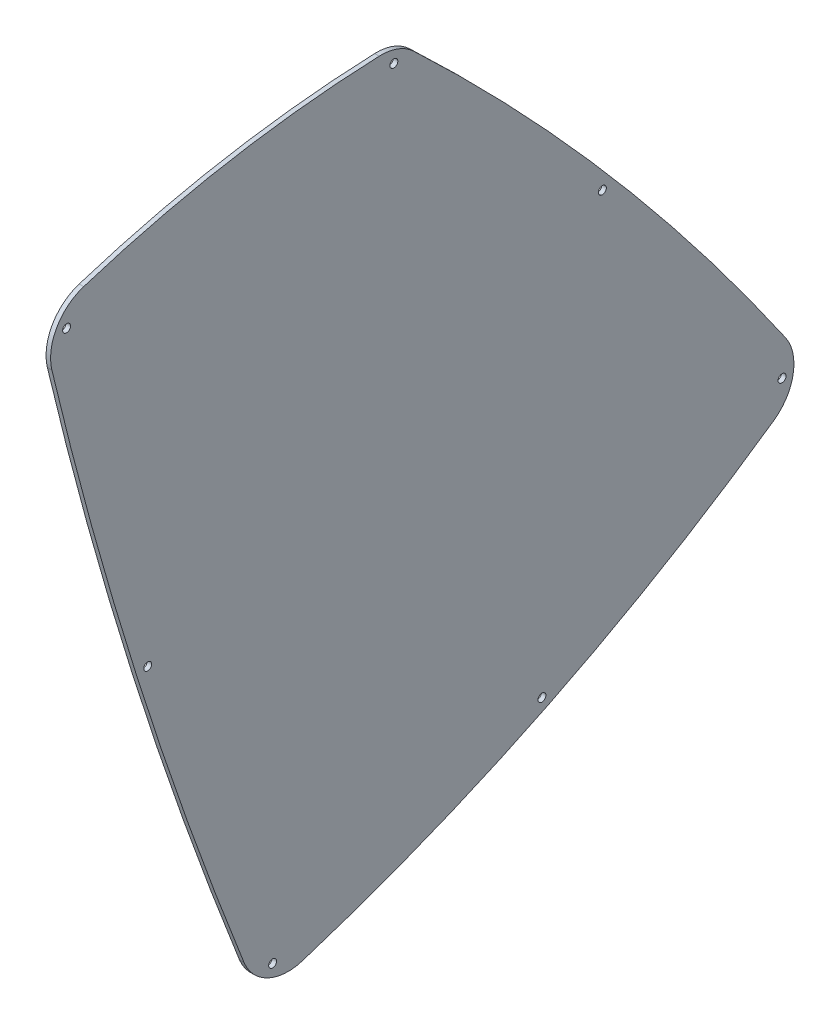
ISO-10303-21;
HEADER;
FILE_DESCRIPTION(('STEP AP214'),'2;1');
FILE_NAME('part.step','',(''),(''),'','','');
FILE_SCHEMA(('AUTOMOTIVE_DESIGN { 1 0 10303 214 1 1 1 1 }'));
ENDSEC;
DATA;
#1=APPLICATION_CONTEXT('core data for automotive mechanical design processes');
#2=APPLICATION_PROTOCOL_DEFINITION('international standard','automotive_design',2000,#1);
#3=PRODUCT_CONTEXT('',#1,'mechanical');
#4=PRODUCT('Part','Part','',(#3));
#5=PRODUCT_RELATED_PRODUCT_CATEGORY('part','',(#4));
#6=PRODUCT_DEFINITION_FORMATION('','',#4);
#7=PRODUCT_DEFINITION_CONTEXT('part definition',#1,'design');
#8=PRODUCT_DEFINITION('design','',#6,#7);
#9=PRODUCT_DEFINITION_SHAPE('','',#8);
#10=(LENGTH_UNIT() NAMED_UNIT(*) SI_UNIT(.MILLI.,.METRE.));
#11=(NAMED_UNIT(*) PLANE_ANGLE_UNIT() SI_UNIT($,.RADIAN.));
#12=(NAMED_UNIT(*) SI_UNIT($,.STERADIAN.) SOLID_ANGLE_UNIT());
#13=UNCERTAINTY_MEASURE_WITH_UNIT(LENGTH_MEASURE(1.E-05),#10,'distance_accuracy_value','');
#14=(GEOMETRIC_REPRESENTATION_CONTEXT(3) GLOBAL_UNCERTAINTY_ASSIGNED_CONTEXT((#13)) GLOBAL_UNIT_ASSIGNED_CONTEXT((#10,
#11,#12)) REPRESENTATION_CONTEXT('',''));
#15=CARTESIAN_POINT('',(0.,0.,0.));
#16=DIRECTION('',(0.,0.,1.));
#17=DIRECTION('',(1.,0.,0.));
#18=AXIS2_PLACEMENT_3D('',#15,#16,#17);
#19=CARTESIAN_POINT('',(2.,349.878011883501,663.961249422803));
#20=DIRECTION('',(1.,0.,0.));
#21=DIRECTION('',(0.,0.,-1.));
#22=AXIS2_PLACEMENT_3D('',#19,#20,#21);
#23=PLANE('',#22);
#24=CARTESIAN_POINT('',(2.,68.9927015622542,1381.04378584218));
#25=DIRECTION('',(1.,0.,0.));
#26=DIRECTION('',(0.,0.,-1.));
#27=AXIS2_PLACEMENT_3D('',#24,#25,#26);
#28=CIRCLE('',#27,1.74999999999987);
#29=CARTESIAN_POINT('',(2.,68.9927015622542,1379.29378584218));
#30=VERTEX_POINT('',#29);
#31=EDGE_CURVE('E203',#30,#30,#28,.T.);
#32=ORIENTED_EDGE('',*,*,#31,.F.);
#33=EDGE_LOOP('',(#32));
#34=FACE_BOUND('',#33,.T.);
#35=CARTESIAN_POINT('',(2.,134.456762464315,1617.5244171696));
#36=DIRECTION('',(1.,0.,0.));
#37=DIRECTION('',(0.,0.,-1.));
#38=AXIS2_PLACEMENT_3D('',#35,#36,#37);
#39=CIRCLE('',#38,1.74999999999987);
#40=CARTESIAN_POINT('',(2.,134.456762464315,1615.7744171696));
#41=VERTEX_POINT('',#40);
#42=EDGE_CURVE('E191',#41,#41,#39,.T.);
#43=ORIENTED_EDGE('',*,*,#42,.F.);
#44=EDGE_LOOP('',(#43));
#45=FACE_BOUND('',#44,.T.);
#46=CARTESIAN_POINT('',(2.,-153.787607790801,1526.58797668578));
#47=DIRECTION('',(1.,0.,0.));
#48=DIRECTION('',(0.,0.,-1.));
#49=AXIS2_PLACEMENT_3D('',#46,#47,#48);
#50=CIRCLE('',#49,1.74999999999987);
#51=CARTESIAN_POINT('',(2.,-153.787607790801,1524.83797668578));
#52=VERTEX_POINT('',#51);
#53=EDGE_CURVE('E179',#52,#52,#50,.T.);
#54=ORIENTED_EDGE('',*,*,#53,.F.);
#55=EDGE_LOOP('',(#54));
#56=FACE_BOUND('',#55,.T.);
#57=CARTESIAN_POINT('',(2.,126.585837185612,1603.59428668719));
#58=DIRECTION('',(1.,0.,0.));
#59=DIRECTION('',(0.,0.,-1.));
#60=AXIS2_PLACEMENT_3D('',#57,#58,#59);
#61=CIRCLE('',#60,20.9999999999997);
#62=CARTESIAN_POINT('',(2.,146.592071884232,1609.97790424964));
#63=VERTEX_POINT('',#62);
#64=CARTESIAN_POINT('',(2.,121.730654260932,1624.0253218731));
#65=VERTEX_POINT('',#64);
#66=EDGE_CURVE('E142',#63,#65,#61,.T.);
#67=ORIENTED_EDGE('',*,*,#66,.T.);
#68=CARTESIAN_POINT('',(2.,573.17018658139,-275.671787841579));
#69=DIRECTION('',(1.,0.,0.));
#70=DIRECTION('',(0.,0.,-1.));
#71=AXIS2_PLACEMENT_3D('',#68,#69,#70);
#72=CIRCLE('',#71,1952.6);
#73=CARTESIAN_POINT('',(2.,-147.086014910758,1539.2325523957));
#74=VERTEX_POINT('',#73);
#75=EDGE_CURVE('E90',#65,#74,#72,.T.);
#76=ORIENTED_EDGE('',*,*,#75,.T.);
#77=CARTESIAN_POINT('',(2.,-139.339738033091,1519.71345419587));
#78=DIRECTION('',(1.,0.,0.));
#79=DIRECTION('',(0.,0.,-1.));
#80=AXIS2_PLACEMENT_3D('',#77,#78,#79);
#81=CIRCLE('',#80,21.0000000000002);
#82=CARTESIAN_POINT('',(2.,-159.371937758911,1513.41178980106));
#83=VERTEX_POINT('',#82);
#84=EDGE_CURVE('E157',#74,#83,#81,.T.);
#85=ORIENTED_EDGE('',*,*,#84,.T.);
#86=CARTESIAN_POINT('',(2.,566.556823733921,1741.77210429875));
#87=DIRECTION('',(1.,0.,0.));
#88=DIRECTION('',(0.,0.,-1.));
#89=AXIS2_PLACEMENT_3D('',#86,#87,#88);
#90=CIRCLE('',#89,761.);
#91=CARTESIAN_POINT('',(2.,-56.9381211241414,1305.45220590258));
#92=VERTEX_POINT('',#91);
#93=EDGE_CURVE('E170',#83,#92,#90,.T.);
#94=ORIENTED_EDGE('',*,*,#93,.T.);
#95=CARTESIAN_POINT('',(2.,-39.7326101622236,1317.49257103572));
#96=DIRECTION('',(1.,0.,0.));
#97=DIRECTION('',(0.,0.,-1.));
#98=AXIS2_PLACEMENT_3D('',#95,#96,#97);
#99=CIRCLE('',#98,21.0000000000001);
#100=CARTESIAN_POINT('',(2.,-27.8056829045682,1300.20823112381));
#101=VERTEX_POINT('',#100);
#102=EDGE_CURVE('E109',#92,#101,#99,.T.);
#103=ORIENTED_EDGE('',*,*,#102,.T.);
#104=CARTESIAN_POINT('',(2.,-715.59182142936,2296.93849937754));
#105=DIRECTION('',(1.,0.,0.));
#106=DIRECTION('',(0.,0.,-1.));
#107=AXIS2_PLACEMENT_3D('',#104,#105,#106);
#108=CIRCLE('',#107,1211.);
#109=CARTESIAN_POINT('',(2.,163.730785841053,1464.28445816765));
#110=VERTEX_POINT('',#109);
#111=EDGE_CURVE('E103',#101,#110,#108,.T.);
#112=ORIENTED_EDGE('',*,*,#111,.T.);
#113=CARTESIAN_POINT('',(2.,148.48241692885,1478.72354558747));
#114=DIRECTION('',(1.,0.,0.));
#115=DIRECTION('',(0.,0.,-1.));
#116=AXIS2_PLACEMENT_3D('',#113,#114,#115);
#117=CIRCLE('',#116,21.);
#118=CARTESIAN_POINT('',(2.,169.467009445785,1479.52783216462));
#119=VERTEX_POINT('',#118);
#120=EDGE_CURVE('E107',#110,#119,#117,.T.);
#121=ORIENTED_EDGE('',*,*,#120,.T.);
#122=CARTESIAN_POINT('',(2.,-321.172748926367,1460.72284600361));
#123=DIRECTION('',(1.,0.,0.));
#124=DIRECTION('',(0.,0.,-1.));
#125=AXIS2_PLACEMENT_3D('',#122,#123,#124);
#126=CIRCLE('',#125,491.);
#127=EDGE_CURVE('E47',#119,#63,#126,.T.);
#128=ORIENTED_EDGE('',*,*,#127,.T.);
#129=EDGE_LOOP('',(#67,#76,#85,#94,#103,#112,#121,#128));
#130=FACE_BOUND('',#129,.T.);
#131=CARTESIAN_POINT('',(2.,-12.7056417679601,1581.71758268792));
#132=DIRECTION('',(1.,0.,0.));
#133=DIRECTION('',(0.,0.,-1.));
#134=AXIS2_PLACEMENT_3D('',#131,#132,#133);
#135=CIRCLE('',#134,1.74999999999987);
#136=CARTESIAN_POINT('',(2.,-12.7056417679601,1579.96758268792));
#137=VERTEX_POINT('',#136);
#138=EDGE_CURVE('E131',#137,#137,#135,.T.);
#139=ORIENTED_EDGE('',*,*,#138,.F.);
#140=EDGE_LOOP('',(#139));
#141=FACE_BOUND('',#140,.T.);
#142=CARTESIAN_POINT('',(2.,-111.634778861247,1407.71799166219));
#143=DIRECTION('',(1.,0.,0.));
#144=DIRECTION('',(0.,0.,-1.));
#145=AXIS2_PLACEMENT_3D('',#142,#143,#144);
#146=CIRCLE('',#145,1.74999999999987);
#147=CARTESIAN_POINT('',(2.,-111.634778861247,1405.96799166219));
#148=VERTEX_POINT('',#147);
#149=EDGE_CURVE('E185',#148,#148,#146,.T.);
#150=ORIENTED_EDGE('',*,*,#149,.F.);
#151=EDGE_LOOP('',(#150));
#152=FACE_BOUND('',#151,.T.);
#153=CARTESIAN_POINT('',(2.,-42.5671292873626,1301.74565065968));
#154=DIRECTION('',(1.,0.,0.));
#155=DIRECTION('',(0.,0.,-1.));
#156=AXIS2_PLACEMENT_3D('',#153,#154,#155);
#157=CIRCLE('',#156,1.74999999999987);
#158=CARTESIAN_POINT('',(2.,-42.5671292873626,1299.99565065968));
#159=VERTEX_POINT('',#158);
#160=EDGE_CURVE('E197',#159,#159,#157,.T.);
#161=ORIENTED_EDGE('',*,*,#160,.F.);
#162=EDGE_LOOP('',(#161));
#163=FACE_BOUND('',#162,.T.);
#164=CARTESIAN_POINT('',(2.,163.457227862599,1473.0883847647));
#165=DIRECTION('',(1.,0.,0.));
#166=DIRECTION('',(0.,0.,-1.));
#167=AXIS2_PLACEMENT_3D('',#164,#165,#166);
#168=CIRCLE('',#167,1.74999999999987);
#169=CARTESIAN_POINT('',(2.,163.457227862599,1471.3383847647));
#170=VERTEX_POINT('',#169);
#171=EDGE_CURVE('E209',#170,#170,#168,.T.);
#172=ORIENTED_EDGE('',*,*,#171,.F.);
#173=EDGE_LOOP('',(#172));
#174=FACE_BOUND('',#173,.T.);
#175=ADVANCED_FACE('F30',(#34,#45,#56,#130,#141,#152,#163,#174),#23,.T.);
#176=CARTESIAN_POINT('',(0.,349.878011883501,663.961249422803));
#177=DIRECTION('',(1.,0.,0.));
#178=DIRECTION('',(0.,0.,-1.));
#179=AXIS2_PLACEMENT_3D('',#176,#177,#178);
#180=PLANE('',#179);
#181=CARTESIAN_POINT('',(0.,126.585837185612,1603.59428668719));
#182=DIRECTION('',(1.,0.,0.));
#183=DIRECTION('',(0.,0.,-1.));
#184=AXIS2_PLACEMENT_3D('',#181,#182,#183);
#185=CIRCLE('',#184,20.9999999999997);
#186=CARTESIAN_POINT('',(0.,146.592071884232,1609.97790424964));
#187=VERTEX_POINT('',#186);
#188=CARTESIAN_POINT('',(0.,121.730654260932,1624.0253218731));
#189=VERTEX_POINT('',#188);
#190=EDGE_CURVE('E127',#187,#189,#185,.T.);
#191=ORIENTED_EDGE('',*,*,#190,.F.);
#192=CARTESIAN_POINT('',(0.,-321.172748926367,1460.72284600361));
#193=DIRECTION('',(1.,0.,0.));
#194=DIRECTION('',(0.,0.,-1.));
#195=AXIS2_PLACEMENT_3D('',#192,#193,#194);
#196=CIRCLE('',#195,491.);
#197=CARTESIAN_POINT('',(0.,169.467009445785,1479.52783216462));
#198=VERTEX_POINT('',#197);
#199=EDGE_CURVE('E82',#198,#187,#196,.T.);
#200=ORIENTED_EDGE('',*,*,#199,.F.);
#201=CARTESIAN_POINT('',(0.,148.48241692885,1478.72354558747));
#202=DIRECTION('',(1.,0.,0.));
#203=DIRECTION('',(0.,0.,-1.));
#204=AXIS2_PLACEMENT_3D('',#201,#202,#203);
#205=CIRCLE('',#204,21.);
#206=CARTESIAN_POINT('',(0.,163.730785841053,1464.28445816765));
#207=VERTEX_POINT('',#206);
#208=EDGE_CURVE('E76',#207,#198,#205,.T.);
#209=ORIENTED_EDGE('',*,*,#208,.F.);
#210=CARTESIAN_POINT('',(0.,-715.59182142936,2296.93849937754));
#211=DIRECTION('',(1.,0.,0.));
#212=DIRECTION('',(0.,0.,-1.));
#213=AXIS2_PLACEMENT_3D('',#210,#211,#212);
#214=CIRCLE('',#213,1211.);
#215=CARTESIAN_POINT('',(0.,-27.8056829045682,1300.20823112381));
#216=VERTEX_POINT('',#215);
#217=EDGE_CURVE('E117',#216,#207,#214,.T.);
#218=ORIENTED_EDGE('',*,*,#217,.F.);
#219=CARTESIAN_POINT('',(0.,-39.7326101622236,1317.49257103572));
#220=DIRECTION('',(1.,0.,0.));
#221=DIRECTION('',(0.,0.,-1.));
#222=AXIS2_PLACEMENT_3D('',#219,#220,#221);
#223=CIRCLE('',#222,21.0000000000001);
#224=CARTESIAN_POINT('',(0.,-56.9381211241414,1305.45220590258));
#225=VERTEX_POINT('',#224);
#226=EDGE_CURVE('E137',#225,#216,#223,.T.);
#227=ORIENTED_EDGE('',*,*,#226,.F.);
#228=CARTESIAN_POINT('',(0.,566.556823733921,1741.77210429875));
#229=DIRECTION('',(1.,0.,0.));
#230=DIRECTION('',(0.,0.,-1.));
#231=AXIS2_PLACEMENT_3D('',#228,#229,#230);
#232=CIRCLE('',#231,761.);
#233=CARTESIAN_POINT('',(0.,-159.371937758911,1513.41178980106));
#234=VERTEX_POINT('',#233);
#235=EDGE_CURVE('E135',#234,#225,#232,.T.);
#236=ORIENTED_EDGE('',*,*,#235,.F.);
#237=CARTESIAN_POINT('',(0.,-139.339738033091,1519.71345419587));
#238=DIRECTION('',(1.,0.,0.));
#239=DIRECTION('',(0.,0.,-1.));
#240=AXIS2_PLACEMENT_3D('',#237,#238,#239);
#241=CIRCLE('',#240,21.0000000000002);
#242=CARTESIAN_POINT('',(0.,-147.086014910758,1539.2325523957));
#243=VERTEX_POINT('',#242);
#244=EDGE_CURVE('E133',#243,#234,#241,.T.);
#245=ORIENTED_EDGE('',*,*,#244,.F.);
#246=CARTESIAN_POINT('',(0.,573.17018658139,-275.671787841579));
#247=DIRECTION('',(1.,0.,0.));
#248=DIRECTION('',(0.,0.,-1.));
#249=AXIS2_PLACEMENT_3D('',#246,#247,#248);
#250=CIRCLE('',#249,1952.6);
#251=EDGE_CURVE('E130',#189,#243,#250,.T.);
#252=ORIENTED_EDGE('',*,*,#251,.F.);
#253=EDGE_LOOP('',(#191,#200,#209,#218,#227,#236,#245,#252));
#254=FACE_BOUND('',#253,.T.);
#255=CARTESIAN_POINT('',(0.,-12.7056417679601,1581.71758268792));
#256=DIRECTION('',(1.,0.,0.));
#257=DIRECTION('',(0.,0.,-1.));
#258=AXIS2_PLACEMENT_3D('',#255,#256,#257);
#259=CIRCLE('',#258,1.74999999999987);
#260=CARTESIAN_POINT('',(0.,-12.7056417679601,1579.96758268792));
#261=VERTEX_POINT('',#260);
#262=EDGE_CURVE('E176',#261,#261,#259,.T.);
#263=ORIENTED_EDGE('',*,*,#262,.T.);
#264=EDGE_LOOP('',(#263));
#265=FACE_BOUND('',#264,.T.);
#266=CARTESIAN_POINT('',(0.,-153.787607790801,1526.58797668578));
#267=DIRECTION('',(1.,0.,0.));
#268=DIRECTION('',(0.,0.,-1.));
#269=AXIS2_PLACEMENT_3D('',#266,#267,#268);
#270=CIRCLE('',#269,1.74999999999987);
#271=CARTESIAN_POINT('',(0.,-153.787607790801,1524.83797668578));
#272=VERTEX_POINT('',#271);
#273=EDGE_CURVE('E182',#272,#272,#270,.T.);
#274=ORIENTED_EDGE('',*,*,#273,.T.);
#275=EDGE_LOOP('',(#274));
#276=FACE_BOUND('',#275,.T.);
#277=CARTESIAN_POINT('',(0.,-111.634778861247,1407.71799166219));
#278=DIRECTION('',(1.,0.,0.));
#279=DIRECTION('',(0.,0.,-1.));
#280=AXIS2_PLACEMENT_3D('',#277,#278,#279);
#281=CIRCLE('',#280,1.74999999999987);
#282=CARTESIAN_POINT('',(0.,-111.634778861247,1405.96799166219));
#283=VERTEX_POINT('',#282);
#284=EDGE_CURVE('E188',#283,#283,#281,.T.);
#285=ORIENTED_EDGE('',*,*,#284,.T.);
#286=EDGE_LOOP('',(#285));
#287=FACE_BOUND('',#286,.T.);
#288=CARTESIAN_POINT('',(0.,134.456762464315,1617.5244171696));
#289=DIRECTION('',(1.,0.,0.));
#290=DIRECTION('',(0.,0.,-1.));
#291=AXIS2_PLACEMENT_3D('',#288,#289,#290);
#292=CIRCLE('',#291,1.74999999999987);
#293=CARTESIAN_POINT('',(0.,134.456762464315,1615.7744171696));
#294=VERTEX_POINT('',#293);
#295=EDGE_CURVE('E194',#294,#294,#292,.T.);
#296=ORIENTED_EDGE('',*,*,#295,.T.);
#297=EDGE_LOOP('',(#296));
#298=FACE_BOUND('',#297,.T.);
#299=CARTESIAN_POINT('',(0.,-42.5671292873626,1301.74565065968));
#300=DIRECTION('',(1.,0.,0.));
#301=DIRECTION('',(0.,0.,-1.));
#302=AXIS2_PLACEMENT_3D('',#299,#300,#301);
#303=CIRCLE('',#302,1.74999999999987);
#304=CARTESIAN_POINT('',(0.,-42.5671292873626,1299.99565065968));
#305=VERTEX_POINT('',#304);
#306=EDGE_CURVE('E200',#305,#305,#303,.T.);
#307=ORIENTED_EDGE('',*,*,#306,.T.);
#308=EDGE_LOOP('',(#307));
#309=FACE_BOUND('',#308,.T.);
#310=CARTESIAN_POINT('',(0.,68.9927015622542,1381.04378584218));
#311=DIRECTION('',(1.,0.,0.));
#312=DIRECTION('',(0.,0.,-1.));
#313=AXIS2_PLACEMENT_3D('',#310,#311,#312);
#314=CIRCLE('',#313,1.74999999999987);
#315=CARTESIAN_POINT('',(0.,68.9927015622542,1379.29378584218));
#316=VERTEX_POINT('',#315);
#317=EDGE_CURVE('E206',#316,#316,#314,.T.);
#318=ORIENTED_EDGE('',*,*,#317,.T.);
#319=EDGE_LOOP('',(#318));
#320=FACE_BOUND('',#319,.T.);
#321=CARTESIAN_POINT('',(0.,163.457227862599,1473.0883847647));
#322=DIRECTION('',(1.,0.,0.));
#323=DIRECTION('',(0.,0.,-1.));
#324=AXIS2_PLACEMENT_3D('',#321,#322,#323);
#325=CIRCLE('',#324,1.74999999999987);
#326=CARTESIAN_POINT('',(0.,163.457227862599,1471.3383847647));
#327=VERTEX_POINT('',#326);
#328=EDGE_CURVE('E212',#327,#327,#325,.T.);
#329=ORIENTED_EDGE('',*,*,#328,.T.);
#330=EDGE_LOOP('',(#329));
#331=FACE_BOUND('',#330,.T.);
#332=ADVANCED_FACE('F161',(#254,#265,#276,#287,#298,#309,#320,#331),#180,.F.);
#333=CARTESIAN_POINT('',(2.,126.585837185612,1603.59428668719));
#334=DIRECTION('',(-1.,0.,0.));
#335=DIRECTION('',(0.,0.,1.));
#336=AXIS2_PLACEMENT_3D('',#333,#334,#335);
#337=CYLINDRICAL_SURFACE('',#336,20.9999999999997);
#338=ORIENTED_EDGE('',*,*,#190,.T.);
#339=DIRECTION('',(-1.,0.,0.));
#340=VECTOR('',#339,1.);
#341=CARTESIAN_POINT('',(2.,121.730654260932,1624.0253218731));
#342=LINE('',#341,#340);
#343=EDGE_CURVE('E11',#65,#189,#342,.T.);
#344=ORIENTED_EDGE('',*,*,#343,.F.);
#345=ORIENTED_EDGE('',*,*,#66,.F.);
#346=DIRECTION('',(-1.,0.,0.));
#347=VECTOR('',#346,1.);
#348=CARTESIAN_POINT('',(2.,146.592071884232,1609.97790424964));
#349=LINE('',#348,#347);
#350=EDGE_CURVE('E123',#63,#187,#349,.T.);
#351=ORIENTED_EDGE('',*,*,#350,.T.);
#352=EDGE_LOOP('',(#338,#344,#345,#351));
#353=FACE_BOUND('',#352,.T.);
#354=ADVANCED_FACE('F32',(#353),#337,.T.);
#355=CARTESIAN_POINT('',(2.,573.17018658139,-275.671787841579));
#356=DIRECTION('',(-1.,0.,0.));
#357=DIRECTION('',(0.,0.,1.));
#358=AXIS2_PLACEMENT_3D('',#355,#356,#357);
#359=CYLINDRICAL_SURFACE('',#358,1952.6);
#360=ORIENTED_EDGE('',*,*,#251,.T.);
#361=DIRECTION('',(-1.,0.,0.));
#362=VECTOR('',#361,1.);
#363=CARTESIAN_POINT('',(2.,-147.086014910758,1539.2325523957));
#364=LINE('',#363,#362);
#365=EDGE_CURVE('E39',#74,#243,#364,.T.);
#366=ORIENTED_EDGE('',*,*,#365,.F.);
#367=ORIENTED_EDGE('',*,*,#75,.F.);
#368=ORIENTED_EDGE('',*,*,#343,.T.);
#369=EDGE_LOOP('',(#360,#366,#367,#368));
#370=FACE_BOUND('',#369,.T.);
#371=ADVANCED_FACE('F246',(#370),#359,.T.);
#372=CARTESIAN_POINT('',(2.,-139.339738033091,1519.71345419587));
#373=DIRECTION('',(-1.,0.,0.));
#374=DIRECTION('',(0.,0.,1.));
#375=AXIS2_PLACEMENT_3D('',#372,#373,#374);
#376=CYLINDRICAL_SURFACE('',#375,21.0000000000002);
#377=ORIENTED_EDGE('',*,*,#244,.T.);
#378=DIRECTION('',(-1.,0.,0.));
#379=VECTOR('',#378,1.);
#380=CARTESIAN_POINT('',(2.,-159.371937758911,1513.41178980106));
#381=LINE('',#380,#379);
#382=EDGE_CURVE('E149',#83,#234,#381,.T.);
#383=ORIENTED_EDGE('',*,*,#382,.F.);
#384=ORIENTED_EDGE('',*,*,#84,.F.);
#385=ORIENTED_EDGE('',*,*,#365,.T.);
#386=EDGE_LOOP('',(#377,#383,#384,#385));
#387=FACE_BOUND('',#386,.T.);
#388=ADVANCED_FACE('F155',(#387),#376,.T.);
#389=CARTESIAN_POINT('',(2.,566.556823733921,1741.77210429875));
#390=DIRECTION('',(-1.,0.,0.));
#391=DIRECTION('',(0.,0.,1.));
#392=AXIS2_PLACEMENT_3D('',#389,#390,#391);
#393=CYLINDRICAL_SURFACE('',#392,761.);
#394=ORIENTED_EDGE('',*,*,#235,.T.);
#395=DIRECTION('',(-1.,0.,0.));
#396=VECTOR('',#395,1.);
#397=CARTESIAN_POINT('',(2.,-56.9381211241414,1305.45220590258));
#398=LINE('',#397,#396);
#399=EDGE_CURVE('E146',#92,#225,#398,.T.);
#400=ORIENTED_EDGE('',*,*,#399,.F.);
#401=ORIENTED_EDGE('',*,*,#93,.F.);
#402=ORIENTED_EDGE('',*,*,#382,.T.);
#403=EDGE_LOOP('',(#394,#400,#401,#402));
#404=FACE_BOUND('',#403,.T.);
#405=ADVANCED_FACE('F166',(#404),#393,.T.);
#406=CARTESIAN_POINT('',(2.,-39.7326101622236,1317.49257103572));
#407=DIRECTION('',(-1.,0.,0.));
#408=DIRECTION('',(0.,0.,1.));
#409=AXIS2_PLACEMENT_3D('',#406,#407,#408);
#410=CYLINDRICAL_SURFACE('',#409,21.0000000000001);
#411=ORIENTED_EDGE('',*,*,#226,.T.);
#412=DIRECTION('',(-1.,0.,0.));
#413=VECTOR('',#412,1.);
#414=CARTESIAN_POINT('',(2.,-27.8056829045682,1300.20823112381));
#415=LINE('',#414,#413);
#416=EDGE_CURVE('E118',#101,#216,#415,.T.);
#417=ORIENTED_EDGE('',*,*,#416,.F.);
#418=ORIENTED_EDGE('',*,*,#102,.F.);
#419=ORIENTED_EDGE('',*,*,#399,.T.);
#420=EDGE_LOOP('',(#411,#417,#418,#419));
#421=FACE_BOUND('',#420,.T.);
#422=ADVANCED_FACE('F169',(#421),#410,.T.);
#423=CARTESIAN_POINT('',(2.,-715.59182142936,2296.93849937754));
#424=DIRECTION('',(-1.,0.,0.));
#425=DIRECTION('',(0.,0.,1.));
#426=AXIS2_PLACEMENT_3D('',#423,#424,#425);
#427=CYLINDRICAL_SURFACE('',#426,1211.);
#428=ORIENTED_EDGE('',*,*,#217,.T.);
#429=DIRECTION('',(-1.,0.,0.));
#430=VECTOR('',#429,1.);
#431=CARTESIAN_POINT('',(2.,163.730785841053,1464.28445816765));
#432=LINE('',#431,#430);
#433=EDGE_CURVE('E114',#110,#207,#432,.T.);
#434=ORIENTED_EDGE('',*,*,#433,.F.);
#435=ORIENTED_EDGE('',*,*,#111,.F.);
#436=ORIENTED_EDGE('',*,*,#416,.T.);
#437=EDGE_LOOP('',(#428,#434,#435,#436));
#438=FACE_BOUND('',#437,.T.);
#439=ADVANCED_FACE('F115',(#438),#427,.T.);
#440=CARTESIAN_POINT('',(2.,148.48241692885,1478.72354558747));
#441=DIRECTION('',(-1.,0.,0.));
#442=DIRECTION('',(0.,0.,1.));
#443=AXIS2_PLACEMENT_3D('',#440,#441,#442);
#444=CYLINDRICAL_SURFACE('',#443,21.);
#445=ORIENTED_EDGE('',*,*,#208,.T.);
#446=DIRECTION('',(-1.,0.,0.));
#447=VECTOR('',#446,1.);
#448=CARTESIAN_POINT('',(2.,169.467009445785,1479.52783216462));
#449=LINE('',#448,#447);
#450=EDGE_CURVE('E119',#119,#198,#449,.T.);
#451=ORIENTED_EDGE('',*,*,#450,.F.);
#452=ORIENTED_EDGE('',*,*,#120,.F.);
#453=ORIENTED_EDGE('',*,*,#433,.T.);
#454=EDGE_LOOP('',(#445,#451,#452,#453));
#455=FACE_BOUND('',#454,.T.);
#456=ADVANCED_FACE('F121',(#455),#444,.T.);
#457=CARTESIAN_POINT('',(2.,-321.172748926367,1460.72284600361));
#458=DIRECTION('',(-1.,0.,0.));
#459=DIRECTION('',(0.,0.,1.));
#460=AXIS2_PLACEMENT_3D('',#457,#458,#459);
#461=CYLINDRICAL_SURFACE('',#460,491.);
#462=ORIENTED_EDGE('',*,*,#199,.T.);
#463=ORIENTED_EDGE('',*,*,#350,.F.);
#464=ORIENTED_EDGE('',*,*,#127,.F.);
#465=ORIENTED_EDGE('',*,*,#450,.T.);
#466=EDGE_LOOP('',(#462,#463,#464,#465));
#467=FACE_BOUND('',#466,.T.);
#468=ADVANCED_FACE('F234',(#467),#461,.T.);
#469=CARTESIAN_POINT('',(2.,-12.7056417679601,1581.71758268792));
#470=DIRECTION('',(-1.,0.,0.));
#471=DIRECTION('',(0.,0.,1.));
#472=AXIS2_PLACEMENT_3D('',#469,#470,#471);
#473=CYLINDRICAL_SURFACE('',#472,1.74999999999987);
#474=ORIENTED_EDGE('',*,*,#138,.T.);
#475=EDGE_LOOP('',(#474));
#476=FACE_BOUND('',#475,.T.);
#477=ORIENTED_EDGE('',*,*,#262,.F.);
#478=EDGE_LOOP('',(#477));
#479=FACE_BOUND('',#478,.T.);
#480=ADVANCED_FACE('F231',(#476,#479),#473,.F.);
#481=CARTESIAN_POINT('',(2.,-153.787607790801,1526.58797668578));
#482=DIRECTION('',(-1.,0.,0.));
#483=DIRECTION('',(0.,0.,1.));
#484=AXIS2_PLACEMENT_3D('',#481,#482,#483);
#485=CYLINDRICAL_SURFACE('',#484,1.74999999999987);
#486=ORIENTED_EDGE('',*,*,#53,.T.);
#487=EDGE_LOOP('',(#486));
#488=FACE_BOUND('',#487,.T.);
#489=ORIENTED_EDGE('',*,*,#273,.F.);
#490=EDGE_LOOP('',(#489));
#491=FACE_BOUND('',#490,.T.);
#492=ADVANCED_FACE('F310',(#488,#491),#485,.F.);
#493=CARTESIAN_POINT('',(2.,-111.634778861247,1407.71799166219));
#494=DIRECTION('',(-1.,0.,0.));
#495=DIRECTION('',(0.,0.,1.));
#496=AXIS2_PLACEMENT_3D('',#493,#494,#495);
#497=CYLINDRICAL_SURFACE('',#496,1.74999999999987);
#498=ORIENTED_EDGE('',*,*,#149,.T.);
#499=EDGE_LOOP('',(#498));
#500=FACE_BOUND('',#499,.T.);
#501=ORIENTED_EDGE('',*,*,#284,.F.);
#502=EDGE_LOOP('',(#501));
#503=FACE_BOUND('',#502,.T.);
#504=ADVANCED_FACE('F318',(#500,#503),#497,.F.);
#505=CARTESIAN_POINT('',(2.,134.456762464315,1617.5244171696));
#506=DIRECTION('',(-1.,0.,0.));
#507=DIRECTION('',(0.,0.,1.));
#508=AXIS2_PLACEMENT_3D('',#505,#506,#507);
#509=CYLINDRICAL_SURFACE('',#508,1.74999999999987);
#510=ORIENTED_EDGE('',*,*,#42,.T.);
#511=EDGE_LOOP('',(#510));
#512=FACE_BOUND('',#511,.T.);
#513=ORIENTED_EDGE('',*,*,#295,.F.);
#514=EDGE_LOOP('',(#513));
#515=FACE_BOUND('',#514,.T.);
#516=ADVANCED_FACE('F326',(#512,#515),#509,.F.);
#517=CARTESIAN_POINT('',(2.,-42.5671292873626,1301.74565065968));
#518=DIRECTION('',(-1.,0.,0.));
#519=DIRECTION('',(0.,0.,1.));
#520=AXIS2_PLACEMENT_3D('',#517,#518,#519);
#521=CYLINDRICAL_SURFACE('',#520,1.74999999999987);
#522=ORIENTED_EDGE('',*,*,#160,.T.);
#523=EDGE_LOOP('',(#522));
#524=FACE_BOUND('',#523,.T.);
#525=ORIENTED_EDGE('',*,*,#306,.F.);
#526=EDGE_LOOP('',(#525));
#527=FACE_BOUND('',#526,.T.);
#528=ADVANCED_FACE('F335',(#524,#527),#521,.F.);
#529=CARTESIAN_POINT('',(2.,68.9927015622542,1381.04378584218));
#530=DIRECTION('',(-1.,0.,0.));
#531=DIRECTION('',(0.,0.,1.));
#532=AXIS2_PLACEMENT_3D('',#529,#530,#531);
#533=CYLINDRICAL_SURFACE('',#532,1.74999999999987);
#534=ORIENTED_EDGE('',*,*,#31,.T.);
#535=EDGE_LOOP('',(#534));
#536=FACE_BOUND('',#535,.T.);
#537=ORIENTED_EDGE('',*,*,#317,.F.);
#538=EDGE_LOOP('',(#537));
#539=FACE_BOUND('',#538,.T.);
#540=ADVANCED_FACE('F344',(#536,#539),#533,.F.);
#541=CARTESIAN_POINT('',(2.,163.457227862599,1473.0883847647));
#542=DIRECTION('',(-1.,0.,0.));
#543=DIRECTION('',(0.,0.,1.));
#544=AXIS2_PLACEMENT_3D('',#541,#542,#543);
#545=CYLINDRICAL_SURFACE('',#544,1.74999999999987);
#546=ORIENTED_EDGE('',*,*,#171,.T.);
#547=EDGE_LOOP('',(#546));
#548=FACE_BOUND('',#547,.T.);
#549=ORIENTED_EDGE('',*,*,#328,.F.);
#550=EDGE_LOOP('',(#549));
#551=FACE_BOUND('',#550,.T.);
#552=ADVANCED_FACE('F218',(#548,#551),#545,.F.);
#553=CLOSED_SHELL('',(#175,#332,#354,#371,#388,#405,#422,#439,#456,#468,#480,#492,#504,#516,
#528,#540,#552));
#554=MANIFOLD_SOLID_BREP('B2',#553);
#555=ADVANCED_BREP_SHAPE_REPRESENTATION('',(#18,#554),#14);
#556=SHAPE_DEFINITION_REPRESENTATION(#9,#555);
ENDSEC;
END-ISO-10303-21;
